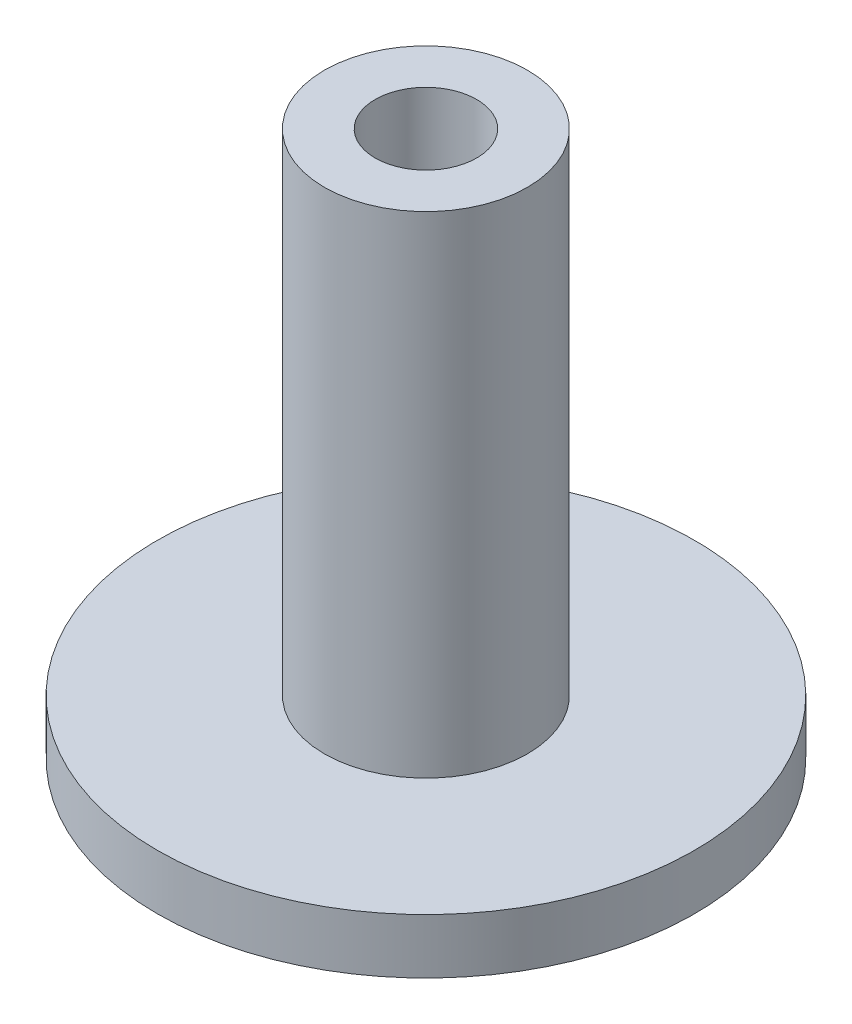
ISO-10303-21;
HEADER;
FILE_DESCRIPTION(('STEP AP214'),'2;1');
FILE_NAME('part.step','',(''),(''),'','','');
FILE_SCHEMA(('AUTOMOTIVE_DESIGN { 1 0 10303 214 1 1 1 1 }'));
ENDSEC;
DATA;
#1=APPLICATION_CONTEXT('core data for automotive mechanical design processes');
#2=APPLICATION_PROTOCOL_DEFINITION('international standard','automotive_design',2000,#1);
#3=PRODUCT_CONTEXT('',#1,'mechanical');
#4=PRODUCT('Part','Part','',(#3));
#5=PRODUCT_RELATED_PRODUCT_CATEGORY('part','',(#4));
#6=PRODUCT_DEFINITION_FORMATION('','',#4);
#7=PRODUCT_DEFINITION_CONTEXT('part definition',#1,'design');
#8=PRODUCT_DEFINITION('design','',#6,#7);
#9=PRODUCT_DEFINITION_SHAPE('','',#8);
#10=(LENGTH_UNIT() NAMED_UNIT(*) SI_UNIT(.MILLI.,.METRE.));
#11=(NAMED_UNIT(*) PLANE_ANGLE_UNIT() SI_UNIT($,.RADIAN.));
#12=(NAMED_UNIT(*) SI_UNIT($,.STERADIAN.) SOLID_ANGLE_UNIT());
#13=UNCERTAINTY_MEASURE_WITH_UNIT(LENGTH_MEASURE(1.E-05),#10,'distance_accuracy_value','');
#14=(GEOMETRIC_REPRESENTATION_CONTEXT(3) GLOBAL_UNCERTAINTY_ASSIGNED_CONTEXT((#13)) GLOBAL_UNIT_ASSIGNED_CONTEXT((#10,
#11,#12)) REPRESENTATION_CONTEXT('',''));
#15=CARTESIAN_POINT('',(0.,0.,0.));
#16=DIRECTION('',(0.,0.,1.));
#17=DIRECTION('',(1.,0.,0.));
#18=AXIS2_PLACEMENT_3D('',#15,#16,#17);
#19=CARTESIAN_POINT('',(0.,1.3,0.));
#20=DIRECTION('',(0.,-1.,0.));
#21=DIRECTION('',(0.,0.,-1.00000000000001));
#22=AXIS2_PLACEMENT_3D('',#19,#20,#21);
#23=CYLINDRICAL_SURFACE('',#22,6.35);
#24=CARTESIAN_POINT('',(0.,1.3,0.));
#25=DIRECTION('',(0.,1.,0.));
#26=DIRECTION('',(0.,0.,1.00000000000001));
#27=AXIS2_PLACEMENT_3D('',#24,#25,#26);
#28=CIRCLE('',#27,6.35);
#29=CARTESIAN_POINT('',(0.,1.3,6.35000000000004));
#30=VERTEX_POINT('',#29);
#31=EDGE_CURVE('E51',#30,#30,#28,.T.);
#32=ORIENTED_EDGE('',*,*,#31,.F.);
#33=EDGE_LOOP('',(#32));
#34=FACE_BOUND('',#33,.T.);
#35=CARTESIAN_POINT('',(0.,0.,0.));
#36=DIRECTION('',(0.,1.,0.));
#37=DIRECTION('',(0.,0.,1.00000000000001));
#38=AXIS2_PLACEMENT_3D('',#35,#36,#37);
#39=CIRCLE('',#38,6.35);
#40=CARTESIAN_POINT('',(0.,0.,6.35000000000004));
#41=VERTEX_POINT('',#40);
#42=EDGE_CURVE('E47',#41,#41,#39,.T.);
#43=ORIENTED_EDGE('',*,*,#42,.T.);
#44=EDGE_LOOP('',(#43));
#45=FACE_BOUND('',#44,.T.);
#46=ADVANCED_FACE('F44',(#34,#45),#23,.T.);
#47=CARTESIAN_POINT('',(0.,1.3,0.));
#48=DIRECTION('',(0.,1.,0.));
#49=DIRECTION('',(0.,0.,1.00000000000001));
#50=AXIS2_PLACEMENT_3D('',#47,#48,#49);
#51=PLANE('',#50);
#52=CARTESIAN_POINT('',(0.,1.3,0.));
#53=DIRECTION('',(0.,1.,0.));
#54=DIRECTION('',(0.,0.,1.00000000000001));
#55=AXIS2_PLACEMENT_3D('',#52,#53,#54);
#56=CIRCLE('',#55,2.4);
#57=CARTESIAN_POINT('',(0.,1.3,2.40000000000001));
#58=VERTEX_POINT('',#57);
#59=EDGE_CURVE('E12',#58,#58,#56,.T.);
#60=ORIENTED_EDGE('',*,*,#59,.F.);
#61=EDGE_LOOP('',(#60));
#62=FACE_BOUND('',#61,.T.);
#63=ORIENTED_EDGE('',*,*,#31,.T.);
#64=EDGE_LOOP('',(#63));
#65=FACE_BOUND('',#64,.T.);
#66=ADVANCED_FACE('F88',(#62,#65),#51,.T.);
#67=CARTESIAN_POINT('',(0.,0.,0.));
#68=DIRECTION('',(0.,1.,0.));
#69=DIRECTION('',(0.,0.,1.00000000000001));
#70=AXIS2_PLACEMENT_3D('',#67,#68,#69);
#71=PLANE('',#70);
#72=CARTESIAN_POINT('',(0.,0.,0.));
#73=DIRECTION('',(0.,1.,0.));
#74=DIRECTION('',(0.,0.,1.00000000000001));
#75=AXIS2_PLACEMENT_3D('',#72,#73,#74);
#76=CIRCLE('',#75,1.2);
#77=CARTESIAN_POINT('',(0.,0.,1.20000000000001));
#78=VERTEX_POINT('',#77);
#79=EDGE_CURVE('E60',#78,#78,#76,.T.);
#80=ORIENTED_EDGE('',*,*,#79,.T.);
#81=EDGE_LOOP('',(#80));
#82=FACE_BOUND('',#81,.T.);
#83=ORIENTED_EDGE('',*,*,#42,.F.);
#84=EDGE_LOOP('',(#83));
#85=FACE_BOUND('',#84,.T.);
#86=ADVANCED_FACE('F67',(#82,#85),#71,.F.);
#87=CARTESIAN_POINT('',(0.,12.9,0.));
#88=DIRECTION('',(0.,-1.,0.));
#89=DIRECTION('',(0.,0.,-1.00000000000001));
#90=AXIS2_PLACEMENT_3D('',#87,#88,#89);
#91=CYLINDRICAL_SURFACE('',#90,2.4);
#92=CARTESIAN_POINT('',(0.,12.9,0.));
#93=DIRECTION('',(0.,1.,0.));
#94=DIRECTION('',(0.,0.,1.00000000000001));
#95=AXIS2_PLACEMENT_3D('',#92,#93,#94);
#96=CIRCLE('',#95,2.4);
#97=CARTESIAN_POINT('',(0.,12.9,2.40000000000001));
#98=VERTEX_POINT('',#97);
#99=EDGE_CURVE('E57',#98,#98,#96,.T.);
#100=ORIENTED_EDGE('',*,*,#99,.F.);
#101=EDGE_LOOP('',(#100));
#102=FACE_BOUND('',#101,.T.);
#103=ORIENTED_EDGE('',*,*,#59,.T.);
#104=EDGE_LOOP('',(#103));
#105=FACE_BOUND('',#104,.T.);
#106=ADVANCED_FACE('F79',(#102,#105),#91,.T.);
#107=CARTESIAN_POINT('',(0.,12.9,0.));
#108=DIRECTION('',(0.,1.,0.));
#109=DIRECTION('',(0.,0.,1.00000000000001));
#110=AXIS2_PLACEMENT_3D('',#107,#108,#109);
#111=PLANE('',#110);
#112=CARTESIAN_POINT('',(0.,12.9,0.));
#113=DIRECTION('',(0.,1.,0.));
#114=DIRECTION('',(0.,0.,1.00000000000001));
#115=AXIS2_PLACEMENT_3D('',#112,#113,#114);
#116=CIRCLE('',#115,1.2);
#117=CARTESIAN_POINT('',(0.,12.9,1.20000000000001));
#118=VERTEX_POINT('',#117);
#119=EDGE_CURVE('E61',#118,#118,#116,.T.);
#120=ORIENTED_EDGE('',*,*,#119,.F.);
#121=EDGE_LOOP('',(#120));
#122=FACE_BOUND('',#121,.T.);
#123=ORIENTED_EDGE('',*,*,#99,.T.);
#124=EDGE_LOOP('',(#123));
#125=FACE_BOUND('',#124,.T.);
#126=ADVANCED_FACE('F73',(#122,#125),#111,.T.);
#127=CARTESIAN_POINT('',(0.,0.,0.));
#128=DIRECTION('',(0.,1.,0.));
#129=DIRECTION('',(0.,0.,1.00000000000001));
#130=AXIS2_PLACEMENT_3D('',#127,#128,#129);
#131=CYLINDRICAL_SURFACE('',#130,1.2);
#132=ORIENTED_EDGE('',*,*,#79,.F.);
#133=EDGE_LOOP('',(#132));
#134=FACE_BOUND('',#133,.T.);
#135=ORIENTED_EDGE('',*,*,#119,.T.);
#136=EDGE_LOOP('',(#135));
#137=FACE_BOUND('',#136,.T.);
#138=ADVANCED_FACE('F70',(#134,#137),#131,.F.);
#139=CLOSED_SHELL('',(#46,#66,#86,#106,#126,#138));
#140=MANIFOLD_SOLID_BREP('B2',#139);
#141=ADVANCED_BREP_SHAPE_REPRESENTATION('',(#18,#140),#14);
#142=SHAPE_DEFINITION_REPRESENTATION(#9,#141);
ENDSEC;
END-ISO-10303-21;
